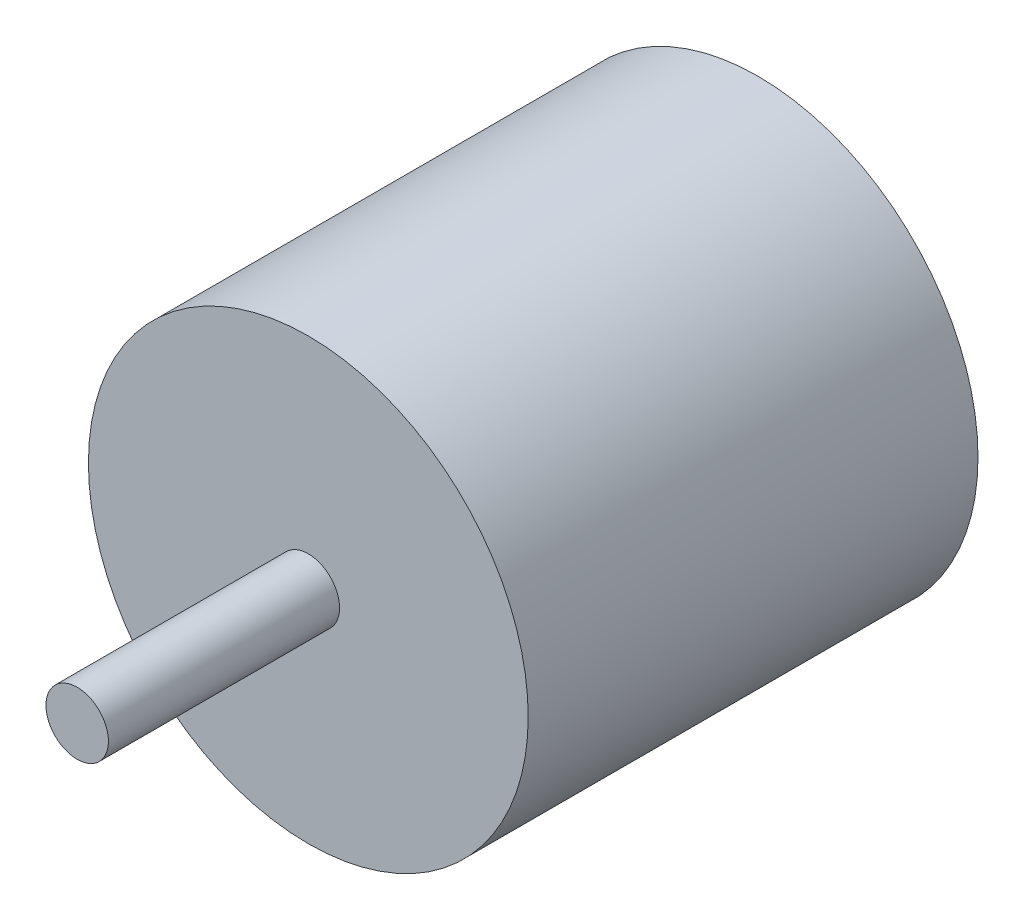
ISO-10303-21;
HEADER;
FILE_DESCRIPTION(('STEP AP214'),'2;1');
FILE_NAME('part.step','',(''),(''),'','','');
FILE_SCHEMA(('AUTOMOTIVE_DESIGN { 1 0 10303 214 1 1 1 1 }'));
ENDSEC;
DATA;
#1=APPLICATION_CONTEXT('core data for automotive mechanical design processes');
#2=APPLICATION_PROTOCOL_DEFINITION('international standard','automotive_design',2000,#1);
#3=PRODUCT_CONTEXT('',#1,'mechanical');
#4=PRODUCT('Part','Part','',(#3));
#5=PRODUCT_RELATED_PRODUCT_CATEGORY('part','',(#4));
#6=PRODUCT_DEFINITION_FORMATION('','',#4);
#7=PRODUCT_DEFINITION_CONTEXT('part definition',#1,'design');
#8=PRODUCT_DEFINITION('design','',#6,#7);
#9=PRODUCT_DEFINITION_SHAPE('','',#8);
#10=(LENGTH_UNIT() NAMED_UNIT(*) SI_UNIT(.MILLI.,.METRE.));
#11=(NAMED_UNIT(*) PLANE_ANGLE_UNIT() SI_UNIT($,.RADIAN.));
#12=(NAMED_UNIT(*) SI_UNIT($,.STERADIAN.) SOLID_ANGLE_UNIT());
#13=UNCERTAINTY_MEASURE_WITH_UNIT(LENGTH_MEASURE(1.E-05),#10,'distance_accuracy_value','');
#14=(GEOMETRIC_REPRESENTATION_CONTEXT(3) GLOBAL_UNCERTAINTY_ASSIGNED_CONTEXT((#13)) GLOBAL_UNIT_ASSIGNED_CONTEXT((#10,
#11,#12)) REPRESENTATION_CONTEXT('',''));
#15=CARTESIAN_POINT('',(0.,0.,0.));
#16=DIRECTION('',(0.,0.,1.));
#17=DIRECTION('',(1.,0.,0.));
#18=AXIS2_PLACEMENT_3D('',#15,#16,#17);
#19=CARTESIAN_POINT('',(0.,0.,36.));
#20=DIRECTION('',(0.,0.,-1.));
#21=DIRECTION('',(-1.,0.,0.));
#22=AXIS2_PLACEMENT_3D('',#19,#20,#21);
#23=CYLINDRICAL_SURFACE('',#22,17.6);
#24=CARTESIAN_POINT('',(0.,0.,36.));
#25=DIRECTION('',(0.,0.,1.));
#26=DIRECTION('',(1.,0.,0.));
#27=AXIS2_PLACEMENT_3D('',#24,#25,#26);
#28=CIRCLE('',#27,17.6);
#29=CARTESIAN_POINT('',(17.6,0.,36.));
#30=VERTEX_POINT('',#29);
#31=EDGE_CURVE('E10',#30,#30,#28,.T.);
#32=ORIENTED_EDGE('',*,*,#31,.F.);
#33=EDGE_LOOP('',(#32));
#34=FACE_BOUND('',#33,.T.);
#35=CARTESIAN_POINT('',(0.,0.,0.));
#36=DIRECTION('',(0.,0.,1.));
#37=DIRECTION('',(1.,0.,0.));
#38=AXIS2_PLACEMENT_3D('',#35,#36,#37);
#39=CIRCLE('',#38,17.6);
#40=CARTESIAN_POINT('',(17.6,0.,0.));
#41=VERTEX_POINT('',#40);
#42=EDGE_CURVE('E41',#41,#41,#39,.T.);
#43=ORIENTED_EDGE('',*,*,#42,.T.);
#44=EDGE_LOOP('',(#43));
#45=FACE_BOUND('',#44,.T.);
#46=ADVANCED_FACE('F38',(#34,#45),#23,.T.);
#47=CARTESIAN_POINT('',(0.,0.,36.));
#48=DIRECTION('',(0.,0.,1.));
#49=DIRECTION('',(1.,0.,0.));
#50=AXIS2_PLACEMENT_3D('',#47,#48,#49);
#51=PLANE('',#50);
#52=CARTESIAN_POINT('',(0.,0.,36.));
#53=DIRECTION('',(0.,0.,1.));
#54=DIRECTION('',(1.,0.,0.));
#55=AXIS2_PLACEMENT_3D('',#52,#53,#54);
#56=CIRCLE('',#55,2.5);
#57=CARTESIAN_POINT('',(2.5,0.,36.));
#58=VERTEX_POINT('',#57);
#59=EDGE_CURVE('E56',#58,#58,#56,.T.);
#60=ORIENTED_EDGE('',*,*,#59,.F.);
#61=EDGE_LOOP('',(#60));
#62=FACE_BOUND('',#61,.T.);
#63=ORIENTED_EDGE('',*,*,#31,.T.);
#64=EDGE_LOOP('',(#63));
#65=FACE_BOUND('',#64,.T.);
#66=ADVANCED_FACE('F99',(#62,#65),#51,.T.);
#67=CARTESIAN_POINT('',(0.,0.,0.));
#68=DIRECTION('',(0.,0.,1.));
#69=DIRECTION('',(1.,0.,0.));
#70=AXIS2_PLACEMENT_3D('',#67,#68,#69);
#71=PLANE('',#70);
#72=CARTESIAN_POINT('',(0.,12.5,0.));
#73=DIRECTION('',(0.,0.,-1.));
#74=DIRECTION('',(-1.,0.,0.));
#75=AXIS2_PLACEMENT_3D('',#72,#73,#74);
#76=CIRCLE('',#75,1.5);
#77=CARTESIAN_POINT('',(-1.5,12.5,0.));
#78=VERTEX_POINT('',#77);
#79=EDGE_CURVE('E80',#78,#78,#76,.T.);
#80=ORIENTED_EDGE('',*,*,#79,.F.);
#81=EDGE_LOOP('',(#80));
#82=FACE_BOUND('',#81,.T.);
#83=CARTESIAN_POINT('',(9.5,0.,0.));
#84=DIRECTION('',(0.,0.,-1.));
#85=DIRECTION('',(-1.,0.,0.));
#86=AXIS2_PLACEMENT_3D('',#83,#84,#85);
#87=CIRCLE('',#86,1.5);
#88=CARTESIAN_POINT('',(8.,0.,0.));
#89=VERTEX_POINT('',#88);
#90=EDGE_CURVE('E74',#89,#89,#87,.T.);
#91=ORIENTED_EDGE('',*,*,#90,.F.);
#92=EDGE_LOOP('',(#91));
#93=FACE_BOUND('',#92,.T.);
#94=CARTESIAN_POINT('',(0.,-12.5,0.));
#95=DIRECTION('',(0.,0.,-1.));
#96=DIRECTION('',(1.,0.,0.));
#97=AXIS2_PLACEMENT_3D('',#94,#95,#96);
#98=CIRCLE('',#97,1.5);
#99=CARTESIAN_POINT('',(1.5,-12.5,0.));
#100=VERTEX_POINT('',#99);
#101=EDGE_CURVE('E68',#100,#100,#98,.T.);
#102=ORIENTED_EDGE('',*,*,#101,.F.);
#103=EDGE_LOOP('',(#102));
#104=FACE_BOUND('',#103,.T.);
#105=CARTESIAN_POINT('',(-9.5,0.,0.));
#106=DIRECTION('',(0.,0.,-1.));
#107=DIRECTION('',(1.,0.,0.));
#108=AXIS2_PLACEMENT_3D('',#105,#106,#107);
#109=CIRCLE('',#108,1.5);
#110=CARTESIAN_POINT('',(-8.,0.,0.));
#111=VERTEX_POINT('',#110);
#112=EDGE_CURVE('E62',#111,#111,#109,.T.);
#113=ORIENTED_EDGE('',*,*,#112,.F.);
#114=EDGE_LOOP('',(#113));
#115=FACE_BOUND('',#114,.T.);
#116=CARTESIAN_POINT('',(0.,0.,0.));
#117=DIRECTION('',(0.,0.,1.));
#118=DIRECTION('',(1.,0.,0.));
#119=AXIS2_PLACEMENT_3D('',#116,#117,#118);
#120=CIRCLE('',#119,2.5);
#121=CARTESIAN_POINT('',(2.5,0.,0.));
#122=VERTEX_POINT('',#121);
#123=EDGE_CURVE('E50',#122,#122,#120,.T.);
#124=ORIENTED_EDGE('',*,*,#123,.T.);
#125=EDGE_LOOP('',(#124));
#126=FACE_BOUND('',#125,.T.);
#127=ORIENTED_EDGE('',*,*,#42,.F.);
#128=EDGE_LOOP('',(#127));
#129=FACE_BOUND('',#128,.T.);
#130=ADVANCED_FACE('F95',(#82,#93,#104,#115,#126,#129),#71,.F.);
#131=CARTESIAN_POINT('',(0.,0.,-2.));
#132=DIRECTION('',(0.,0.,1.));
#133=DIRECTION('',(1.,0.,0.));
#134=AXIS2_PLACEMENT_3D('',#131,#132,#133);
#135=CYLINDRICAL_SURFACE('',#134,2.5);
#136=CARTESIAN_POINT('',(0.,0.,-2.));
#137=DIRECTION('',(0.,0.,1.));
#138=DIRECTION('',(1.,0.,0.));
#139=AXIS2_PLACEMENT_3D('',#136,#137,#138);
#140=CIRCLE('',#139,2.5);
#141=CARTESIAN_POINT('',(2.5,0.,-2.));
#142=VERTEX_POINT('',#141);
#143=EDGE_CURVE('E48',#142,#142,#140,.T.);
#144=ORIENTED_EDGE('',*,*,#143,.T.);
#145=EDGE_LOOP('',(#144));
#146=FACE_BOUND('',#145,.T.);
#147=ORIENTED_EDGE('',*,*,#123,.F.);
#148=EDGE_LOOP('',(#147));
#149=FACE_BOUND('',#148,.T.);
#150=ADVANCED_FACE('F98',(#146,#149),#135,.T.);
#151=CARTESIAN_POINT('',(0.,0.,-2.));
#152=DIRECTION('',(0.,0.,1.));
#153=DIRECTION('',(1.,0.,0.));
#154=AXIS2_PLACEMENT_3D('',#151,#152,#153);
#155=PLANE('',#154);
#156=ORIENTED_EDGE('',*,*,#143,.F.);
#157=EDGE_LOOP('',(#156));
#158=FACE_BOUND('',#157,.T.);
#159=ADVANCED_FACE('F123',(#158),#155,.F.);
#160=CARTESIAN_POINT('',(0.,0.,54.5));
#161=DIRECTION('',(0.,0.,-1.));
#162=DIRECTION('',(-1.,0.,0.));
#163=AXIS2_PLACEMENT_3D('',#160,#161,#162);
#164=CYLINDRICAL_SURFACE('',#163,2.5);
#165=CARTESIAN_POINT('',(0.,0.,54.5));
#166=DIRECTION('',(0.,0.,1.));
#167=DIRECTION('',(1.,0.,0.));
#168=AXIS2_PLACEMENT_3D('',#165,#166,#167);
#169=CIRCLE('',#168,2.5);
#170=CARTESIAN_POINT('',(2.5,0.,54.5));
#171=VERTEX_POINT('',#170);
#172=EDGE_CURVE('E53',#171,#171,#169,.T.);
#173=ORIENTED_EDGE('',*,*,#172,.F.);
#174=EDGE_LOOP('',(#173));
#175=FACE_BOUND('',#174,.T.);
#176=ORIENTED_EDGE('',*,*,#59,.T.);
#177=EDGE_LOOP('',(#176));
#178=FACE_BOUND('',#177,.T.);
#179=ADVANCED_FACE('F127',(#175,#178),#164,.T.);
#180=CARTESIAN_POINT('',(0.,0.,54.5));
#181=DIRECTION('',(0.,0.,1.));
#182=DIRECTION('',(1.,0.,0.));
#183=AXIS2_PLACEMENT_3D('',#180,#181,#182);
#184=PLANE('',#183);
#185=ORIENTED_EDGE('',*,*,#172,.T.);
#186=EDGE_LOOP('',(#185));
#187=FACE_BOUND('',#186,.T.);
#188=ADVANCED_FACE('F131',(#187),#184,.T.);
#189=CARTESIAN_POINT('',(-9.5,0.,3.));
#190=DIRECTION('',(0.,0.,-1.));
#191=DIRECTION('',(-1.,0.,0.));
#192=AXIS2_PLACEMENT_3D('',#189,#190,#191);
#193=CYLINDRICAL_SURFACE('',#192,1.5);
#194=CARTESIAN_POINT('',(-9.5,0.,3.));
#195=DIRECTION('',(0.,0.,-1.));
#196=DIRECTION('',(1.,0.,0.));
#197=AXIS2_PLACEMENT_3D('',#194,#195,#196);
#198=CIRCLE('',#197,1.5);
#199=CARTESIAN_POINT('',(-8.,0.,3.));
#200=VERTEX_POINT('',#199);
#201=EDGE_CURVE('E65',#200,#200,#198,.T.);
#202=ORIENTED_EDGE('',*,*,#201,.F.);
#203=EDGE_LOOP('',(#202));
#204=FACE_BOUND('',#203,.T.);
#205=ORIENTED_EDGE('',*,*,#112,.T.);
#206=EDGE_LOOP('',(#205));
#207=FACE_BOUND('',#206,.T.);
#208=ADVANCED_FACE('F135',(#204,#207),#193,.F.);
#209=CARTESIAN_POINT('',(-9.5,0.,3.));
#210=DIRECTION('',(0.,0.,1.));
#211=DIRECTION('',(1.,0.,0.));
#212=AXIS2_PLACEMENT_3D('',#209,#210,#211);
#213=PLANE('',#212);
#214=ORIENTED_EDGE('',*,*,#201,.T.);
#215=EDGE_LOOP('',(#214));
#216=FACE_BOUND('',#215,.T.);
#217=ADVANCED_FACE('F139',(#216),#213,.F.);
#218=CARTESIAN_POINT('',(0.,-12.5,3.));
#219=DIRECTION('',(0.,0.,-1.));
#220=DIRECTION('',(-1.,0.,0.));
#221=AXIS2_PLACEMENT_3D('',#218,#219,#220);
#222=CYLINDRICAL_SURFACE('',#221,1.5);
#223=CARTESIAN_POINT('',(0.,-12.5,3.));
#224=DIRECTION('',(0.,0.,-1.));
#225=DIRECTION('',(1.,0.,0.));
#226=AXIS2_PLACEMENT_3D('',#223,#224,#225);
#227=CIRCLE('',#226,1.5);
#228=CARTESIAN_POINT('',(1.5,-12.5,3.));
#229=VERTEX_POINT('',#228);
#230=EDGE_CURVE('E71',#229,#229,#227,.T.);
#231=ORIENTED_EDGE('',*,*,#230,.F.);
#232=EDGE_LOOP('',(#231));
#233=FACE_BOUND('',#232,.T.);
#234=ORIENTED_EDGE('',*,*,#101,.T.);
#235=EDGE_LOOP('',(#234));
#236=FACE_BOUND('',#235,.T.);
#237=ADVANCED_FACE('F143',(#233,#236),#222,.F.);
#238=CARTESIAN_POINT('',(0.,-12.5,3.));
#239=DIRECTION('',(0.,0.,1.));
#240=DIRECTION('',(1.,0.,0.));
#241=AXIS2_PLACEMENT_3D('',#238,#239,#240);
#242=PLANE('',#241);
#243=ORIENTED_EDGE('',*,*,#230,.T.);
#244=EDGE_LOOP('',(#243));
#245=FACE_BOUND('',#244,.T.);
#246=ADVANCED_FACE('F147',(#245),#242,.F.);
#247=CARTESIAN_POINT('',(9.5,0.,3.));
#248=DIRECTION('',(0.,0.,-1.));
#249=DIRECTION('',(-1.,0.,0.));
#250=AXIS2_PLACEMENT_3D('',#247,#248,#249);
#251=CYLINDRICAL_SURFACE('',#250,1.5);
#252=CARTESIAN_POINT('',(9.5,0.,3.));
#253=DIRECTION('',(0.,0.,-1.));
#254=DIRECTION('',(-1.,0.,0.));
#255=AXIS2_PLACEMENT_3D('',#252,#253,#254);
#256=CIRCLE('',#255,1.5);
#257=CARTESIAN_POINT('',(8.,0.,3.));
#258=VERTEX_POINT('',#257);
#259=EDGE_CURVE('E77',#258,#258,#256,.T.);
#260=ORIENTED_EDGE('',*,*,#259,.F.);
#261=EDGE_LOOP('',(#260));
#262=FACE_BOUND('',#261,.T.);
#263=ORIENTED_EDGE('',*,*,#90,.T.);
#264=EDGE_LOOP('',(#263));
#265=FACE_BOUND('',#264,.T.);
#266=ADVANCED_FACE('F151',(#262,#265),#251,.F.);
#267=CARTESIAN_POINT('',(9.5,0.,3.));
#268=DIRECTION('',(0.,0.,-1.));
#269=DIRECTION('',(-1.,0.,0.));
#270=AXIS2_PLACEMENT_3D('',#267,#268,#269);
#271=PLANE('',#270);
#272=ORIENTED_EDGE('',*,*,#259,.T.);
#273=EDGE_LOOP('',(#272));
#274=FACE_BOUND('',#273,.T.);
#275=ADVANCED_FACE('F91',(#274),#271,.T.);
#276=CARTESIAN_POINT('',(0.,12.5,3.));
#277=DIRECTION('',(0.,0.,-1.));
#278=DIRECTION('',(-1.,0.,0.));
#279=AXIS2_PLACEMENT_3D('',#276,#277,#278);
#280=CYLINDRICAL_SURFACE('',#279,1.5);
#281=CARTESIAN_POINT('',(0.,12.5,3.));
#282=DIRECTION('',(0.,0.,-1.));
#283=DIRECTION('',(-1.,0.,0.));
#284=AXIS2_PLACEMENT_3D('',#281,#282,#283);
#285=CIRCLE('',#284,1.5);
#286=CARTESIAN_POINT('',(-1.5,12.5,3.));
#287=VERTEX_POINT('',#286);
#288=EDGE_CURVE('E59',#287,#287,#285,.T.);
#289=ORIENTED_EDGE('',*,*,#288,.F.);
#290=EDGE_LOOP('',(#289));
#291=FACE_BOUND('',#290,.T.);
#292=ORIENTED_EDGE('',*,*,#79,.T.);
#293=EDGE_LOOP('',(#292));
#294=FACE_BOUND('',#293,.T.);
#295=ADVANCED_FACE('F88',(#291,#294),#280,.F.);
#296=CARTESIAN_POINT('',(0.,12.5,3.));
#297=DIRECTION('',(0.,0.,-1.));
#298=DIRECTION('',(-1.,0.,0.));
#299=AXIS2_PLACEMENT_3D('',#296,#297,#298);
#300=PLANE('',#299);
#301=ORIENTED_EDGE('',*,*,#288,.T.);
#302=EDGE_LOOP('',(#301));
#303=FACE_BOUND('',#302,.T.);
#304=ADVANCED_FACE('F86',(#303),#300,.T.);
#305=CLOSED_SHELL('',(#46,#66,#130,#150,#159,#179,#188,#208,#217,#237,#246,#266,#275,#295,#304));
#306=MANIFOLD_SOLID_BREP('B2',#305);
#307=ADVANCED_BREP_SHAPE_REPRESENTATION('',(#18,#306),#14);
#308=SHAPE_DEFINITION_REPRESENTATION(#9,#307);
ENDSEC;
END-ISO-10303-21;
